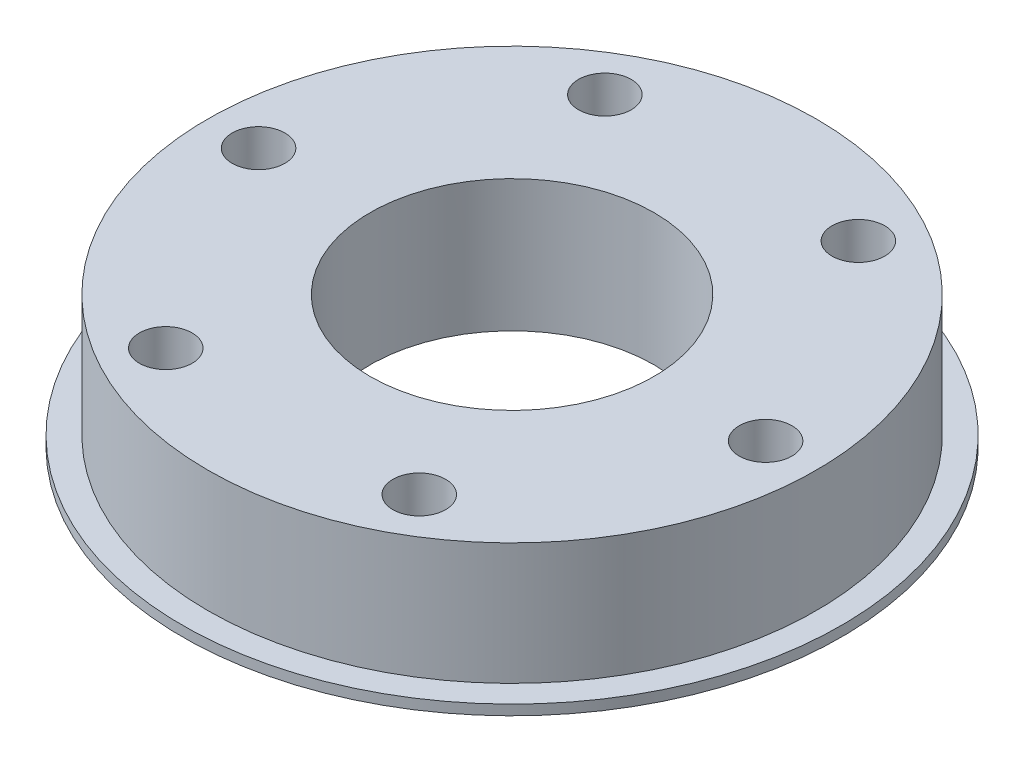
ISO-10303-21;
HEADER;
FILE_DESCRIPTION(('STEP AP214'),'2;1');
FILE_NAME('part.step','',(''),(''),'','','');
FILE_SCHEMA(('AUTOMOTIVE_DESIGN { 1 0 10303 214 1 1 1 1 }'));
ENDSEC;
DATA;
#1=APPLICATION_CONTEXT('core data for automotive mechanical design processes');
#2=APPLICATION_PROTOCOL_DEFINITION('international standard','automotive_design',2000,#1);
#3=PRODUCT_CONTEXT('',#1,'mechanical');
#4=PRODUCT('Part','Part','',(#3));
#5=PRODUCT_RELATED_PRODUCT_CATEGORY('part','',(#4));
#6=PRODUCT_DEFINITION_FORMATION('','',#4);
#7=PRODUCT_DEFINITION_CONTEXT('part definition',#1,'design');
#8=PRODUCT_DEFINITION('design','',#6,#7);
#9=PRODUCT_DEFINITION_SHAPE('','',#8);
#10=(LENGTH_UNIT() NAMED_UNIT(*) SI_UNIT(.MILLI.,.METRE.));
#11=(NAMED_UNIT(*) PLANE_ANGLE_UNIT() SI_UNIT($,.RADIAN.));
#12=(NAMED_UNIT(*) SI_UNIT($,.STERADIAN.) SOLID_ANGLE_UNIT());
#13=UNCERTAINTY_MEASURE_WITH_UNIT(LENGTH_MEASURE(1.E-05),#10,'distance_accuracy_value','');
#14=(GEOMETRIC_REPRESENTATION_CONTEXT(3) GLOBAL_UNCERTAINTY_ASSIGNED_CONTEXT((#13)) GLOBAL_UNIT_ASSIGNED_CONTEXT((#10,
#11,#12)) REPRESENTATION_CONTEXT('',''));
#15=CARTESIAN_POINT('',(0.,0.,0.));
#16=DIRECTION('',(0.,0.,1.));
#17=DIRECTION('',(1.,0.,0.));
#18=AXIS2_PLACEMENT_3D('',#15,#16,#17);
#19=CARTESIAN_POINT('',(0.,13.,0.));
#20=DIRECTION('',(0.,-1.,0.));
#21=DIRECTION('',(0.,0.,-1.));
#22=AXIS2_PLACEMENT_3D('',#19,#20,#21);
#23=CYLINDRICAL_SURFACE('',#22,30.);
#24=CARTESIAN_POINT('',(0.,13.,0.));
#25=DIRECTION('',(0.,1.,0.));
#26=DIRECTION('',(0.,0.,1.));
#27=AXIS2_PLACEMENT_3D('',#24,#25,#26);
#28=CIRCLE('',#27,30.);
#29=CARTESIAN_POINT('',(0.,13.,-30.));
#30=VERTEX_POINT('',#29);
#31=EDGE_CURVE('E39',#30,#30,#28,.T.);
#32=CARTESIAN_POINT('',(0.,0.999999999999999,0.));
#33=DIRECTION('',(0.,-1.,0.));
#34=DIRECTION('',(0.,0.,-1.));
#35=AXIS2_PLACEMENT_3D('',#32,#33,#34);
#36=CIRCLE('',#35,30.);
#37=CARTESIAN_POINT('',(0.,1.,-30.));
#38=VERTEX_POINT('',#37);
#39=EDGE_CURVE('E10',#38,#38,#36,.T.);
#40=CARTESIAN_POINT('',(0.,13.,-30.));
#41=CARTESIAN_POINT('',(0.,12.875,-30.));
#42=CARTESIAN_POINT('',(0.,12.75,-30.));
#43=CARTESIAN_POINT('',(0.,12.5,-30.));
#44=CARTESIAN_POINT('',(0.,12.375,-30.));
#45=CARTESIAN_POINT('',(0.,12.125,-30.));
#46=CARTESIAN_POINT('',(0.,12.,-30.));
#47=CARTESIAN_POINT('',(0.,11.75,-30.));
#48=CARTESIAN_POINT('',(0.,11.625,-30.));
#49=CARTESIAN_POINT('',(0.,11.375,-30.));
#50=CARTESIAN_POINT('',(0.,11.25,-30.));
#51=CARTESIAN_POINT('',(0.,11.,-30.));
#52=CARTESIAN_POINT('',(0.,10.875,-30.));
#53=CARTESIAN_POINT('',(0.,10.625,-30.));
#54=CARTESIAN_POINT('',(0.,10.5,-30.));
#55=CARTESIAN_POINT('',(0.,10.25,-30.));
#56=CARTESIAN_POINT('',(0.,10.125,-30.));
#57=CARTESIAN_POINT('',(0.,9.875,-30.));
#58=CARTESIAN_POINT('',(0.,9.75,-30.));
#59=CARTESIAN_POINT('',(0.,9.5,-30.));
#60=CARTESIAN_POINT('',(0.,9.375,-30.));
#61=CARTESIAN_POINT('',(0.,9.125,-30.));
#62=CARTESIAN_POINT('',(0.,9.,-30.));
#63=CARTESIAN_POINT('',(0.,8.75,-30.));
#64=CARTESIAN_POINT('',(0.,8.625,-30.));
#65=CARTESIAN_POINT('',(0.,8.375,-30.));
#66=CARTESIAN_POINT('',(0.,8.25,-30.));
#67=CARTESIAN_POINT('',(0.,8.,-30.));
#68=CARTESIAN_POINT('',(0.,7.875,-30.));
#69=CARTESIAN_POINT('',(0.,7.625,-30.));
#70=CARTESIAN_POINT('',(0.,7.5,-30.));
#71=CARTESIAN_POINT('',(0.,7.25,-30.));
#72=CARTESIAN_POINT('',(0.,7.125,-30.));
#73=CARTESIAN_POINT('',(0.,6.875,-30.));
#74=CARTESIAN_POINT('',(0.,6.75,-30.));
#75=CARTESIAN_POINT('',(0.,6.5,-30.));
#76=CARTESIAN_POINT('',(0.,6.375,-30.));
#77=CARTESIAN_POINT('',(0.,6.125,-30.));
#78=CARTESIAN_POINT('',(0.,6.,-30.));
#79=CARTESIAN_POINT('',(0.,5.75,-30.));
#80=CARTESIAN_POINT('',(0.,5.625,-30.));
#81=CARTESIAN_POINT('',(0.,5.375,-30.));
#82=CARTESIAN_POINT('',(0.,5.25,-30.));
#83=CARTESIAN_POINT('',(0.,5.,-30.));
#84=CARTESIAN_POINT('',(0.,4.875,-30.));
#85=CARTESIAN_POINT('',(0.,4.625,-30.));
#86=CARTESIAN_POINT('',(0.,4.5,-30.));
#87=CARTESIAN_POINT('',(0.,4.25,-30.));
#88=CARTESIAN_POINT('',(0.,4.125,-30.));
#89=CARTESIAN_POINT('',(0.,3.875,-30.));
#90=CARTESIAN_POINT('',(0.,3.75,-30.));
#91=CARTESIAN_POINT('',(0.,3.5,-30.));
#92=CARTESIAN_POINT('',(0.,3.375,-30.));
#93=CARTESIAN_POINT('',(0.,3.125,-30.));
#94=CARTESIAN_POINT('',(0.,3.,-30.));
#95=CARTESIAN_POINT('',(0.,2.75,-30.));
#96=CARTESIAN_POINT('',(0.,2.625,-30.));
#97=CARTESIAN_POINT('',(0.,2.375,-30.));
#98=CARTESIAN_POINT('',(0.,2.25,-30.));
#99=CARTESIAN_POINT('',(0.,2.,-30.));
#100=CARTESIAN_POINT('',(0.,1.875,-30.));
#101=CARTESIAN_POINT('',(0.,1.625,-30.));
#102=CARTESIAN_POINT('',(0.,1.5,-30.));
#103=CARTESIAN_POINT('',(0.,1.25,-30.));
#104=CARTESIAN_POINT('',(0.,1.125,-30.));
#105=CARTESIAN_POINT('',(0.,1.,-30.));
#106=B_SPLINE_CURVE_WITH_KNOTS('',3,(#40,#41,#42,#43,#44,#45,#46,#47,#48,#49,#50,#51,#52,#53,
#54,#55,#56,#57,#58,#59,#60,#61,#62,#63,#64,#65,#66,#67,#68,#69,#70,#71,#72,#73,#74,#75,#76,#77,
#78,#79,#80,#81,#82,#83,#84,#85,#86,#87,#88,#89,#90,#91,#92,#93,#94,#95,#96,#97,#98,#99,#100,
#101,#102,#103,#104,#105),.UNSPECIFIED.,.F.,.F.,(4,2,2,2,2,2,2,2,2,2,2,2,2,2,2,2,2,2,2,2,2,2,2,
2,2,2,2,2,2,2,2,2,4),(0.,0.374999999999999,0.749999999999999,1.125,1.5,1.875,2.25,2.625,3.,
3.375,3.75,4.125,4.5,4.875,5.25,5.625,6.,6.375,6.75,7.125,7.5,7.875,8.25,8.625,9.,9.375,9.75,
10.125,10.5,10.875,11.25,11.625,12.),.UNSPECIFIED.);
#107=EDGE_CURVE('BSEAM33',#30,#38,#106,.T.);
#108=ORIENTED_EDGE('',*,*,#31,.F.);
#109=ORIENTED_EDGE('',*,*,#39,.F.);
#110=ORIENTED_EDGE('',*,*,#107,.T.);
#111=ORIENTED_EDGE('',*,*,#107,.F.);
#112=EDGE_LOOP('',(#108,#110,#109,#111));
#113=FACE_BOUND('',#112,.T.);
#114=ADVANCED_FACE('F33',(#113),#23,.T.);
#115=CARTESIAN_POINT('',(0.,13.,0.));
#116=DIRECTION('',(0.,1.,0.));
#117=DIRECTION('',(0.,0.,1.));
#118=AXIS2_PLACEMENT_3D('',#115,#116,#117);
#119=PLANE('',#118);
#120=CARTESIAN_POINT('',(-24.9999999999999,13.,-1.29536228065754E-12));
#121=DIRECTION('',(0.,1.,0.));
#122=DIRECTION('',(0.,0.,1.));
#123=AXIS2_PLACEMENT_3D('',#120,#121,#122);
#124=CIRCLE('',#123,2.60000000000062);
#125=CARTESIAN_POINT('',(-24.9999999999999,13.,2.59999999999933));
#126=VERTEX_POINT('',#125);
#127=EDGE_CURVE('E94',#126,#126,#124,.T.);
#128=ORIENTED_EDGE('',*,*,#127,.F.);
#129=EDGE_LOOP('',(#128));
#130=FACE_BOUND('',#129,.T.);
#131=CARTESIAN_POINT('',(-12.4999999999979,13.,-21.6506350946121));
#132=DIRECTION('',(0.,1.,0.));
#133=DIRECTION('',(0.,0.,1.));
#134=AXIS2_PLACEMENT_3D('',#131,#132,#133);
#135=CIRCLE('',#134,2.6000000000016);
#136=CARTESIAN_POINT('',(-12.4999999999979,13.,-19.0506350946105));
#137=VERTEX_POINT('',#136);
#138=EDGE_CURVE('E97',#137,#137,#135,.T.);
#139=ORIENTED_EDGE('',*,*,#138,.F.);
#140=EDGE_LOOP('',(#139));
#141=FACE_BOUND('',#140,.T.);
#142=CARTESIAN_POINT('',(12.5000000000029,13.,-21.6506350946103));
#143=DIRECTION('',(0.,1.,0.));
#144=DIRECTION('',(0.,0.,1.));
#145=AXIS2_PLACEMENT_3D('',#142,#143,#144);
#146=CIRCLE('',#145,2.60000000000225);
#147=CARTESIAN_POINT('',(12.5000000000029,13.,-19.050635094608));
#148=VERTEX_POINT('',#147);
#149=EDGE_CURVE('E100',#148,#148,#146,.T.);
#150=ORIENTED_EDGE('',*,*,#149,.F.);
#151=EDGE_LOOP('',(#150));
#152=FACE_BOUND('',#151,.T.);
#153=CARTESIAN_POINT('',(25.0000000000018,13.,2.32405330191178E-12));
#154=DIRECTION('',(0.,1.,0.));
#155=DIRECTION('',(0.,0.,1.));
#156=AXIS2_PLACEMENT_3D('',#153,#154,#155);
#157=CIRCLE('',#156,2.60000000000187);
#158=CARTESIAN_POINT('',(25.0000000000018,13.,2.60000000000419));
#159=VERTEX_POINT('',#158);
#160=EDGE_CURVE('E103',#159,#159,#157,.T.);
#161=ORIENTED_EDGE('',*,*,#160,.F.);
#162=EDGE_LOOP('',(#161));
#163=FACE_BOUND('',#162,.T.);
#164=CARTESIAN_POINT('',(12.4999999999998,13.,21.6506350946131));
#165=DIRECTION('',(0.,1.,0.));
#166=DIRECTION('',(0.,0.,1.));
#167=AXIS2_PLACEMENT_3D('',#164,#165,#166);
#168=CIRCLE('',#167,2.60000000000078);
#169=CARTESIAN_POINT('',(12.4999999999998,13.,24.2506350946139));
#170=VERTEX_POINT('',#169);
#171=EDGE_CURVE('E106',#170,#170,#168,.T.);
#172=ORIENTED_EDGE('',*,*,#171,.F.);
#173=EDGE_LOOP('',(#172));
#174=FACE_BOUND('',#173,.T.);
#175=CARTESIAN_POINT('',(-12.5000000000011,13.,21.6506350946113));
#176=DIRECTION('',(0.,1.,0.));
#177=DIRECTION('',(0.,0.,1.));
#178=AXIS2_PLACEMENT_3D('',#175,#176,#177);
#179=CIRCLE('',#178,2.6);
#180=CARTESIAN_POINT('',(-12.5000000000011,13.,24.2506350946113));
#181=VERTEX_POINT('',#180);
#182=EDGE_CURVE('E109',#181,#181,#179,.T.);
#183=ORIENTED_EDGE('',*,*,#182,.F.);
#184=EDGE_LOOP('',(#183));
#185=FACE_BOUND('',#184,.T.);
#186=CARTESIAN_POINT('',(0.,13.,0.));
#187=DIRECTION('',(0.,1.,0.));
#188=DIRECTION('',(0.,0.,1.));
#189=AXIS2_PLACEMENT_3D('',#186,#187,#188);
#190=CIRCLE('',#189,14.);
#191=CARTESIAN_POINT('',(0.,13.,14.));
#192=VERTEX_POINT('',#191);
#193=EDGE_CURVE('E82',#192,#192,#190,.T.);
#194=ORIENTED_EDGE('',*,*,#193,.F.);
#195=EDGE_LOOP('',(#194));
#196=FACE_BOUND('',#195,.T.);
#197=ORIENTED_EDGE('',*,*,#31,.T.);
#198=EDGE_LOOP('',(#197));
#199=FACE_BOUND('',#198,.T.);
#200=ADVANCED_FACE('F159',(#130,#141,#152,#163,#174,#185,#196,#199),#119,.T.);
#201=CARTESIAN_POINT('',(0.,1.,0.));
#202=DIRECTION('',(0.,-1.,0.));
#203=DIRECTION('',(0.,0.,-1.));
#204=AXIS2_PLACEMENT_3D('',#201,#202,#203);
#205=CYLINDRICAL_SURFACE('',#204,32.5);
#206=CARTESIAN_POINT('',(0.,1.,0.));
#207=DIRECTION('',(0.,-1.,0.));
#208=DIRECTION('',(0.,0.,-1.));
#209=AXIS2_PLACEMENT_3D('',#206,#207,#208);
#210=CIRCLE('',#209,32.5);
#211=CARTESIAN_POINT('',(0.,1.,-32.5));
#212=VERTEX_POINT('',#211);
#213=EDGE_CURVE('E43',#212,#212,#210,.T.);
#214=ORIENTED_EDGE('',*,*,#213,.T.);
#215=EDGE_LOOP('',(#214));
#216=FACE_BOUND('',#215,.T.);
#217=CARTESIAN_POINT('',(0.,0.,0.));
#218=DIRECTION('',(0.,-1.,0.));
#219=DIRECTION('',(0.,0.,-1.));
#220=AXIS2_PLACEMENT_3D('',#217,#218,#219);
#221=CIRCLE('',#220,32.5);
#222=CARTESIAN_POINT('',(0.,0.,-32.5));
#223=VERTEX_POINT('',#222);
#224=EDGE_CURVE('E47',#223,#223,#221,.T.);
#225=ORIENTED_EDGE('',*,*,#224,.F.);
#226=EDGE_LOOP('',(#225));
#227=FACE_BOUND('',#226,.T.);
#228=ADVANCED_FACE('F157',(#216,#227),#205,.T.);
#229=CARTESIAN_POINT('',(0.,1.,0.));
#230=DIRECTION('',(0.,-1.,0.));
#231=DIRECTION('',(0.,0.,-1.));
#232=AXIS2_PLACEMENT_3D('',#229,#230,#231);
#233=PLANE('',#232);
#234=ORIENTED_EDGE('',*,*,#39,.T.);
#235=EDGE_LOOP('',(#234));
#236=FACE_BOUND('',#235,.T.);
#237=ORIENTED_EDGE('',*,*,#213,.F.);
#238=EDGE_LOOP('',(#237));
#239=FACE_BOUND('',#238,.T.);
#240=ADVANCED_FACE('F137',(#236,#239),#233,.F.);
#241=CARTESIAN_POINT('',(0.,0.,0.));
#242=DIRECTION('',(0.,1.,0.));
#243=DIRECTION('',(0.,0.,1.));
#244=AXIS2_PLACEMENT_3D('',#241,#242,#243);
#245=PLANE('',#244);
#246=CARTESIAN_POINT('',(-24.9999999999999,0.,-1.29536228065754E-12));
#247=DIRECTION('',(0.,-1.,0.));
#248=DIRECTION('',(0.,0.,-1.));
#249=AXIS2_PLACEMENT_3D('',#246,#247,#248);
#250=CIRCLE('',#249,2.60000000000062);
#251=CARTESIAN_POINT('',(-24.9999999999999,0.,-2.60000000000192));
#252=VERTEX_POINT('',#251);
#253=EDGE_CURVE('E116',#252,#252,#250,.T.);
#254=ORIENTED_EDGE('',*,*,#253,.F.);
#255=EDGE_LOOP('',(#254));
#256=FACE_BOUND('',#255,.T.);
#257=CARTESIAN_POINT('',(-12.4999999999979,0.,-21.6506350946121));
#258=DIRECTION('',(0.,-1.,0.));
#259=DIRECTION('',(0.,0.,-1.));
#260=AXIS2_PLACEMENT_3D('',#257,#258,#259);
#261=CIRCLE('',#260,2.6000000000016);
#262=CARTESIAN_POINT('',(-12.4999999999979,0.,-24.2506350946137));
#263=VERTEX_POINT('',#262);
#264=EDGE_CURVE('E119',#263,#263,#261,.T.);
#265=ORIENTED_EDGE('',*,*,#264,.F.);
#266=EDGE_LOOP('',(#265));
#267=FACE_BOUND('',#266,.T.);
#268=CARTESIAN_POINT('',(12.5000000000029,0.,-21.6506350946103));
#269=DIRECTION('',(0.,-1.,0.));
#270=DIRECTION('',(0.,0.,-1.));
#271=AXIS2_PLACEMENT_3D('',#268,#269,#270);
#272=CIRCLE('',#271,2.60000000000225);
#273=CARTESIAN_POINT('',(12.5000000000029,0.,-24.2506350946125));
#274=VERTEX_POINT('',#273);
#275=EDGE_CURVE('E122',#274,#274,#272,.T.);
#276=ORIENTED_EDGE('',*,*,#275,.F.);
#277=EDGE_LOOP('',(#276));
#278=FACE_BOUND('',#277,.T.);
#279=CARTESIAN_POINT('',(25.0000000000018,0.,2.32405330191178E-12));
#280=DIRECTION('',(0.,-1.,0.));
#281=DIRECTION('',(0.,0.,-1.));
#282=AXIS2_PLACEMENT_3D('',#279,#280,#281);
#283=CIRCLE('',#282,2.60000000000187);
#284=CARTESIAN_POINT('',(25.0000000000018,0.,-2.59999999999954));
#285=VERTEX_POINT('',#284);
#286=EDGE_CURVE('E125',#285,#285,#283,.T.);
#287=ORIENTED_EDGE('',*,*,#286,.F.);
#288=EDGE_LOOP('',(#287));
#289=FACE_BOUND('',#288,.T.);
#290=CARTESIAN_POINT('',(12.4999999999998,0.,21.6506350946131));
#291=DIRECTION('',(0.,-1.,0.));
#292=DIRECTION('',(0.,0.,-1.));
#293=AXIS2_PLACEMENT_3D('',#290,#291,#292);
#294=CIRCLE('',#293,2.60000000000078);
#295=CARTESIAN_POINT('',(12.4999999999998,0.,19.0506350946124));
#296=VERTEX_POINT('',#295);
#297=EDGE_CURVE('E115',#296,#296,#294,.T.);
#298=ORIENTED_EDGE('',*,*,#297,.F.);
#299=EDGE_LOOP('',(#298));
#300=FACE_BOUND('',#299,.T.);
#301=CARTESIAN_POINT('',(-12.5000000000011,0.,21.6506350946113));
#302=DIRECTION('',(0.,-1.,0.));
#303=DIRECTION('',(0.,0.,-1.));
#304=AXIS2_PLACEMENT_3D('',#301,#302,#303);
#305=CIRCLE('',#304,2.6);
#306=CARTESIAN_POINT('',(-12.5000000000011,0.,19.0506350946113));
#307=VERTEX_POINT('',#306);
#308=EDGE_CURVE('E112',#307,#307,#305,.T.);
#309=ORIENTED_EDGE('',*,*,#308,.F.);
#310=EDGE_LOOP('',(#309));
#311=FACE_BOUND('',#310,.T.);
#312=CARTESIAN_POINT('',(0.,0.,0.));
#313=DIRECTION('',(0.,-1.,0.));
#314=DIRECTION('',(0.,0.,-1.));
#315=AXIS2_PLACEMENT_3D('',#312,#313,#314);
#316=CIRCLE('',#315,14.);
#317=CARTESIAN_POINT('',(0.,0.,-14.));
#318=VERTEX_POINT('',#317);
#319=EDGE_CURVE('E91',#318,#318,#316,.T.);
#320=ORIENTED_EDGE('',*,*,#319,.F.);
#321=EDGE_LOOP('',(#320));
#322=FACE_BOUND('',#321,.T.);
#323=CARTESIAN_POINT('',(0.,0.,-25.));
#324=DIRECTION('',(0.,1.,0.));
#325=DIRECTION('',(0.,0.,1.));
#326=AXIS2_PLACEMENT_3D('',#323,#324,#325);
#327=CIRCLE('',#326,1.6);
#328=CARTESIAN_POINT('',(0.,0.,-23.4));
#329=VERTEX_POINT('',#328);
#330=EDGE_CURVE('E78',#329,#329,#327,.T.);
#331=ORIENTED_EDGE('',*,*,#330,.T.);
#332=EDGE_LOOP('',(#331));
#333=FACE_BOUND('',#332,.T.);
#334=CARTESIAN_POINT('',(-21.6506350946105,0.,-12.4999999999991));
#335=DIRECTION('',(0.,1.,0.));
#336=DIRECTION('',(0.,0.,1.));
#337=AXIS2_PLACEMENT_3D('',#334,#335,#336);
#338=CIRCLE('',#337,1.6);
#339=CARTESIAN_POINT('',(-21.6506350946105,0.,-10.8999999999991));
#340=VERTEX_POINT('',#339);
#341=EDGE_CURVE('E79',#340,#340,#338,.T.);
#342=ORIENTED_EDGE('',*,*,#341,.T.);
#343=EDGE_LOOP('',(#342));
#344=FACE_BOUND('',#343,.T.);
#345=CARTESIAN_POINT('',(-21.6506350946095,0.,12.5000000000009));
#346=DIRECTION('',(0.,1.,0.));
#347=DIRECTION('',(0.,0.,1.));
#348=AXIS2_PLACEMENT_3D('',#345,#346,#347);
#349=CIRCLE('',#348,1.6);
#350=CARTESIAN_POINT('',(-21.6506350946095,0.,14.1000000000009));
#351=VERTEX_POINT('',#350);
#352=EDGE_CURVE('E53',#351,#351,#349,.T.);
#353=ORIENTED_EDGE('',*,*,#352,.T.);
#354=EDGE_LOOP('',(#353));
#355=FACE_BOUND('',#354,.T.);
#356=CARTESIAN_POINT('',(1.95289281714359E-12,0.,25.));
#357=DIRECTION('',(0.,1.,0.));
#358=DIRECTION('',(0.,0.,1.));
#359=AXIS2_PLACEMENT_3D('',#356,#357,#358);
#360=CIRCLE('',#359,1.6);
#361=CARTESIAN_POINT('',(1.95289281714359E-12,0.,26.6));
#362=VERTEX_POINT('',#361);
#363=EDGE_CURVE('E60',#362,#362,#360,.T.);
#364=ORIENTED_EDGE('',*,*,#363,.T.);
#365=EDGE_LOOP('',(#364));
#366=FACE_BOUND('',#365,.T.);
#367=CARTESIAN_POINT('',(21.6506350946124,0.,12.4999999999992));
#368=DIRECTION('',(0.,1.,0.));
#369=DIRECTION('',(0.,0.,1.));
#370=AXIS2_PLACEMENT_3D('',#367,#368,#369);
#371=CIRCLE('',#370,1.6);
#372=CARTESIAN_POINT('',(21.6506350946124,0.,14.0999999999992));
#373=VERTEX_POINT('',#372);
#374=EDGE_CURVE('E66',#373,#373,#371,.T.);
#375=ORIENTED_EDGE('',*,*,#374,.T.);
#376=EDGE_LOOP('',(#375));
#377=FACE_BOUND('',#376,.T.);
#378=CARTESIAN_POINT('',(21.6506350946114,0.,-12.5000000000009));
#379=DIRECTION('',(0.,1.,0.));
#380=DIRECTION('',(0.,0.,1.));
#381=AXIS2_PLACEMENT_3D('',#378,#379,#380);
#382=CIRCLE('',#381,1.6);
#383=CARTESIAN_POINT('',(21.6506350946114,0.,-10.9000000000008));
#384=VERTEX_POINT('',#383);
#385=EDGE_CURVE('E72',#384,#384,#382,.T.);
#386=ORIENTED_EDGE('',*,*,#385,.T.);
#387=EDGE_LOOP('',(#386));
#388=FACE_BOUND('',#387,.T.);
#389=ORIENTED_EDGE('',*,*,#224,.T.);
#390=EDGE_LOOP('',(#389));
#391=FACE_BOUND('',#390,.T.);
#392=ADVANCED_FACE('F133',(#256,#267,#278,#289,#300,#311,#322,#333,#344,#355,#366,#377,#388,
#391),#245,.F.);
#393=CARTESIAN_POINT('',(21.6506350946114,3.5,-12.5000000000009));
#394=DIRECTION('',(0.,-1.,0.));
#395=DIRECTION('',(0.,0.,-1.));
#396=AXIS2_PLACEMENT_3D('',#393,#394,#395);
#397=CYLINDRICAL_SURFACE('',#396,1.6);
#398=CARTESIAN_POINT('',(21.6506350946114,3.5,-12.5000000000009));
#399=DIRECTION('',(0.,1.,0.));
#400=DIRECTION('',(0.,0.,1.));
#401=AXIS2_PLACEMENT_3D('',#398,#399,#400);
#402=CIRCLE('',#401,1.6);
#403=CARTESIAN_POINT('',(21.6506350946114,3.5,-10.9000000000008));
#404=VERTEX_POINT('',#403);
#405=EDGE_CURVE('E75',#404,#404,#402,.T.);
#406=ORIENTED_EDGE('',*,*,#405,.T.);
#407=EDGE_LOOP('',(#406));
#408=FACE_BOUND('',#407,.T.);
#409=ORIENTED_EDGE('',*,*,#385,.F.);
#410=EDGE_LOOP('',(#409));
#411=FACE_BOUND('',#410,.T.);
#412=ADVANCED_FACE('F136',(#408,#411),#397,.F.);
#413=CARTESIAN_POINT('',(21.6506350946114,3.5,-12.5000000000009));
#414=DIRECTION('',(0.,1.,0.));
#415=DIRECTION('',(0.,0.,1.));
#416=AXIS2_PLACEMENT_3D('',#413,#414,#415);
#417=PLANE('',#416);
#418=ORIENTED_EDGE('',*,*,#405,.F.);
#419=EDGE_LOOP('',(#418));
#420=FACE_BOUND('',#419,.T.);
#421=ADVANCED_FACE('F278',(#420),#417,.F.);
#422=CARTESIAN_POINT('',(21.6506350946124,3.5,12.4999999999992));
#423=DIRECTION('',(0.,-1.,0.));
#424=DIRECTION('',(0.,0.,-1.));
#425=AXIS2_PLACEMENT_3D('',#422,#423,#424);
#426=CYLINDRICAL_SURFACE('',#425,1.6);
#427=CARTESIAN_POINT('',(21.6506350946124,3.5,12.4999999999992));
#428=DIRECTION('',(0.,1.,0.));
#429=DIRECTION('',(0.,0.,1.));
#430=AXIS2_PLACEMENT_3D('',#427,#428,#429);
#431=CIRCLE('',#430,1.6);
#432=CARTESIAN_POINT('',(21.6506350946124,3.5,14.0999999999992));
#433=VERTEX_POINT('',#432);
#434=EDGE_CURVE('E69',#433,#433,#431,.T.);
#435=ORIENTED_EDGE('',*,*,#434,.T.);
#436=EDGE_LOOP('',(#435));
#437=FACE_BOUND('',#436,.T.);
#438=ORIENTED_EDGE('',*,*,#374,.F.);
#439=EDGE_LOOP('',(#438));
#440=FACE_BOUND('',#439,.T.);
#441=ADVANCED_FACE('F281',(#437,#440),#426,.F.);
#442=CARTESIAN_POINT('',(21.6506350946124,3.5,12.4999999999992));
#443=DIRECTION('',(0.,1.,0.));
#444=DIRECTION('',(0.,0.,1.));
#445=AXIS2_PLACEMENT_3D('',#442,#443,#444);
#446=PLANE('',#445);
#447=ORIENTED_EDGE('',*,*,#434,.F.);
#448=EDGE_LOOP('',(#447));
#449=FACE_BOUND('',#448,.T.);
#450=ADVANCED_FACE('F285',(#449),#446,.F.);
#451=CARTESIAN_POINT('',(1.95289281714359E-12,3.5,25.));
#452=DIRECTION('',(0.,-1.,0.));
#453=DIRECTION('',(0.,0.,-1.));
#454=AXIS2_PLACEMENT_3D('',#451,#452,#453);
#455=CYLINDRICAL_SURFACE('',#454,1.6);
#456=CARTESIAN_POINT('',(1.95289281714359E-12,3.5,25.));
#457=DIRECTION('',(0.,1.,0.));
#458=DIRECTION('',(0.,0.,1.));
#459=AXIS2_PLACEMENT_3D('',#456,#457,#458);
#460=CIRCLE('',#459,1.6);
#461=CARTESIAN_POINT('',(1.95289281714359E-12,3.5,26.6));
#462=VERTEX_POINT('',#461);
#463=EDGE_CURVE('E63',#462,#462,#460,.T.);
#464=ORIENTED_EDGE('',*,*,#463,.T.);
#465=EDGE_LOOP('',(#464));
#466=FACE_BOUND('',#465,.T.);
#467=ORIENTED_EDGE('',*,*,#363,.F.);
#468=EDGE_LOOP('',(#467));
#469=FACE_BOUND('',#468,.T.);
#470=ADVANCED_FACE('F288',(#466,#469),#455,.F.);
#471=CARTESIAN_POINT('',(1.95289281714359E-12,3.5,25.));
#472=DIRECTION('',(0.,1.,0.));
#473=DIRECTION('',(0.,0.,1.));
#474=AXIS2_PLACEMENT_3D('',#471,#472,#473);
#475=PLANE('',#474);
#476=ORIENTED_EDGE('',*,*,#463,.F.);
#477=EDGE_LOOP('',(#476));
#478=FACE_BOUND('',#477,.T.);
#479=ADVANCED_FACE('F293',(#478),#475,.F.);
#480=CARTESIAN_POINT('',(-21.6506350946095,3.5,12.5000000000009));
#481=DIRECTION('',(0.,-1.,0.));
#482=DIRECTION('',(0.,0.,-1.));
#483=AXIS2_PLACEMENT_3D('',#480,#481,#482);
#484=CYLINDRICAL_SURFACE('',#483,1.6);
#485=CARTESIAN_POINT('',(-21.6506350946095,3.5,12.5000000000009));
#486=DIRECTION('',(0.,1.,0.));
#487=DIRECTION('',(0.,0.,1.));
#488=AXIS2_PLACEMENT_3D('',#485,#486,#487);
#489=CIRCLE('',#488,1.6);
#490=CARTESIAN_POINT('',(-21.6506350946095,3.5,14.1000000000009));
#491=VERTEX_POINT('',#490);
#492=EDGE_CURVE('E56',#491,#491,#489,.T.);
#493=ORIENTED_EDGE('',*,*,#492,.T.);
#494=EDGE_LOOP('',(#493));
#495=FACE_BOUND('',#494,.T.);
#496=ORIENTED_EDGE('',*,*,#352,.F.);
#497=EDGE_LOOP('',(#496));
#498=FACE_BOUND('',#497,.T.);
#499=ADVANCED_FACE('F296',(#495,#498),#484,.F.);
#500=CARTESIAN_POINT('',(-21.6506350946095,3.5,12.5000000000009));
#501=DIRECTION('',(0.,1.,0.));
#502=DIRECTION('',(0.,0.,1.));
#503=AXIS2_PLACEMENT_3D('',#500,#501,#502);
#504=PLANE('',#503);
#505=ORIENTED_EDGE('',*,*,#492,.F.);
#506=EDGE_LOOP('',(#505));
#507=FACE_BOUND('',#506,.T.);
#508=ADVANCED_FACE('F276',(#507),#504,.F.);
#509=CARTESIAN_POINT('',(-21.6506350946105,3.5,-12.4999999999991));
#510=DIRECTION('',(0.,-1.,0.));
#511=DIRECTION('',(0.,0.,-1.));
#512=AXIS2_PLACEMENT_3D('',#509,#510,#511);
#513=CYLINDRICAL_SURFACE('',#512,1.6);
#514=CARTESIAN_POINT('',(-21.6506350946105,3.5,-12.4999999999991));
#515=DIRECTION('',(0.,1.,0.));
#516=DIRECTION('',(0.,0.,1.));
#517=AXIS2_PLACEMENT_3D('',#514,#515,#516);
#518=CIRCLE('',#517,1.6);
#519=CARTESIAN_POINT('',(-21.6506350946105,3.5,-10.8999999999991));
#520=VERTEX_POINT('',#519);
#521=EDGE_CURVE('E57',#520,#520,#518,.T.);
#522=ORIENTED_EDGE('',*,*,#521,.T.);
#523=EDGE_LOOP('',(#522));
#524=FACE_BOUND('',#523,.T.);
#525=ORIENTED_EDGE('',*,*,#341,.F.);
#526=EDGE_LOOP('',(#525));
#527=FACE_BOUND('',#526,.T.);
#528=ADVANCED_FACE('F272',(#524,#527),#513,.F.);
#529=CARTESIAN_POINT('',(-21.6506350946105,3.5,-12.4999999999991));
#530=DIRECTION('',(0.,1.,0.));
#531=DIRECTION('',(0.,0.,1.));
#532=AXIS2_PLACEMENT_3D('',#529,#530,#531);
#533=PLANE('',#532);
#534=ORIENTED_EDGE('',*,*,#521,.F.);
#535=EDGE_LOOP('',(#534));
#536=FACE_BOUND('',#535,.T.);
#537=ADVANCED_FACE('F268',(#536),#533,.F.);
#538=CARTESIAN_POINT('',(0.,3.5,-25.));
#539=DIRECTION('',(0.,-1.,0.));
#540=DIRECTION('',(0.,0.,-1.));
#541=AXIS2_PLACEMENT_3D('',#538,#539,#540);
#542=CYLINDRICAL_SURFACE('',#541,1.6);
#543=CARTESIAN_POINT('',(0.,3.5,-25.));
#544=DIRECTION('',(0.,1.,0.));
#545=DIRECTION('',(0.,0.,1.));
#546=AXIS2_PLACEMENT_3D('',#543,#544,#545);
#547=CIRCLE('',#546,1.6);
#548=CARTESIAN_POINT('',(0.,3.5,-23.4));
#549=VERTEX_POINT('',#548);
#550=EDGE_CURVE('E51',#549,#549,#547,.T.);
#551=ORIENTED_EDGE('',*,*,#550,.T.);
#552=EDGE_LOOP('',(#551));
#553=FACE_BOUND('',#552,.T.);
#554=ORIENTED_EDGE('',*,*,#330,.F.);
#555=EDGE_LOOP('',(#554));
#556=FACE_BOUND('',#555,.T.);
#557=ADVANCED_FACE('F264',(#553,#556),#542,.F.);
#558=CARTESIAN_POINT('',(0.,3.5,-25.));
#559=DIRECTION('',(0.,1.,0.));
#560=DIRECTION('',(0.,0.,1.));
#561=AXIS2_PLACEMENT_3D('',#558,#559,#560);
#562=PLANE('',#561);
#563=ORIENTED_EDGE('',*,*,#550,.F.);
#564=EDGE_LOOP('',(#563));
#565=FACE_BOUND('',#564,.T.);
#566=ADVANCED_FACE('F260',(#565),#562,.F.);
#567=CARTESIAN_POINT('',(0.,51.,0.));
#568=DIRECTION('',(0.,-1.,0.));
#569=DIRECTION('',(0.,0.,-1.));
#570=AXIS2_PLACEMENT_3D('',#567,#568,#569);
#571=CYLINDRICAL_SURFACE('',#570,14.);
#572=ORIENTED_EDGE('',*,*,#193,.T.);
#573=EDGE_LOOP('',(#572));
#574=FACE_BOUND('',#573,.T.);
#575=ORIENTED_EDGE('',*,*,#319,.T.);
#576=EDGE_LOOP('',(#575));
#577=FACE_BOUND('',#576,.T.);
#578=ADVANCED_FACE('F185',(#574,#577),#571,.F.);
#579=CARTESIAN_POINT('',(-12.5000000000011,25.,21.6506350946113));
#580=DIRECTION('',(0.,-1.,0.));
#581=DIRECTION('',(0.,0.,-1.));
#582=AXIS2_PLACEMENT_3D('',#579,#580,#581);
#583=CYLINDRICAL_SURFACE('',#582,2.6);
#584=ORIENTED_EDGE('',*,*,#182,.T.);
#585=EDGE_LOOP('',(#584));
#586=FACE_BOUND('',#585,.T.);
#587=ORIENTED_EDGE('',*,*,#308,.T.);
#588=EDGE_LOOP('',(#587));
#589=FACE_BOUND('',#588,.T.);
#590=ADVANCED_FACE('F199',(#586,#589),#583,.F.);
#591=CARTESIAN_POINT('',(12.4999999999998,25.,21.6506350946131));
#592=DIRECTION('',(0.,-1.,0.));
#593=DIRECTION('',(0.,0.,-1.));
#594=AXIS2_PLACEMENT_3D('',#591,#592,#593);
#595=CYLINDRICAL_SURFACE('',#594,2.60000000000078);
#596=ORIENTED_EDGE('',*,*,#171,.T.);
#597=EDGE_LOOP('',(#596));
#598=FACE_BOUND('',#597,.T.);
#599=ORIENTED_EDGE('',*,*,#297,.T.);
#600=EDGE_LOOP('',(#599));
#601=FACE_BOUND('',#600,.T.);
#602=ADVANCED_FACE('F131',(#598,#601),#595,.F.);
#603=CARTESIAN_POINT('',(25.0000000000018,25.,2.32405330191178E-12));
#604=DIRECTION('',(0.,-1.,0.));
#605=DIRECTION('',(0.,0.,-1.));
#606=AXIS2_PLACEMENT_3D('',#603,#604,#605);
#607=CYLINDRICAL_SURFACE('',#606,2.60000000000187);
#608=ORIENTED_EDGE('',*,*,#160,.T.);
#609=EDGE_LOOP('',(#608));
#610=FACE_BOUND('',#609,.T.);
#611=ORIENTED_EDGE('',*,*,#286,.T.);
#612=EDGE_LOOP('',(#611));
#613=FACE_BOUND('',#612,.T.);
#614=ADVANCED_FACE('F213',(#610,#613),#607,.F.);
#615=CARTESIAN_POINT('',(12.5000000000029,25.,-21.6506350946103));
#616=DIRECTION('',(0.,-1.,0.));
#617=DIRECTION('',(0.,0.,-1.));
#618=AXIS2_PLACEMENT_3D('',#615,#616,#617);
#619=CYLINDRICAL_SURFACE('',#618,2.60000000000225);
#620=ORIENTED_EDGE('',*,*,#149,.T.);
#621=EDGE_LOOP('',(#620));
#622=FACE_BOUND('',#621,.T.);
#623=ORIENTED_EDGE('',*,*,#275,.T.);
#624=EDGE_LOOP('',(#623));
#625=FACE_BOUND('',#624,.T.);
#626=ADVANCED_FACE('F223',(#622,#625),#619,.F.);
#627=CARTESIAN_POINT('',(-12.4999999999979,25.,-21.6506350946121));
#628=DIRECTION('',(0.,-1.,0.));
#629=DIRECTION('',(0.,0.,-1.));
#630=AXIS2_PLACEMENT_3D('',#627,#628,#629);
#631=CYLINDRICAL_SURFACE('',#630,2.6000000000016);
#632=ORIENTED_EDGE('',*,*,#138,.T.);
#633=EDGE_LOOP('',(#632));
#634=FACE_BOUND('',#633,.T.);
#635=ORIENTED_EDGE('',*,*,#264,.T.);
#636=EDGE_LOOP('',(#635));
#637=FACE_BOUND('',#636,.T.);
#638=ADVANCED_FACE('F233',(#634,#637),#631,.F.);
#639=CARTESIAN_POINT('',(-24.9999999999999,25.,-1.29536228065754E-12));
#640=DIRECTION('',(0.,-1.,0.));
#641=DIRECTION('',(0.,0.,-1.));
#642=AXIS2_PLACEMENT_3D('',#639,#640,#641);
#643=CYLINDRICAL_SURFACE('',#642,2.60000000000062);
#644=ORIENTED_EDGE('',*,*,#127,.T.);
#645=EDGE_LOOP('',(#644));
#646=FACE_BOUND('',#645,.T.);
#647=ORIENTED_EDGE('',*,*,#253,.T.);
#648=EDGE_LOOP('',(#647));
#649=FACE_BOUND('',#648,.T.);
#650=ADVANCED_FACE('F243',(#646,#649),#643,.F.);
#651=CLOSED_SHELL('',(#114,#200,#228,#240,#392,#412,#421,#441,#450,#470,#479,#499,#508,#528,
#537,#557,#566,#578,#590,#602,#614,#626,#638,#650));
#652=MANIFOLD_SOLID_BREP('B2',#651);
#653=ADVANCED_BREP_SHAPE_REPRESENTATION('',(#18,#652),#14);
#654=SHAPE_DEFINITION_REPRESENTATION(#9,#653);
ENDSEC;
END-ISO-10303-21;
